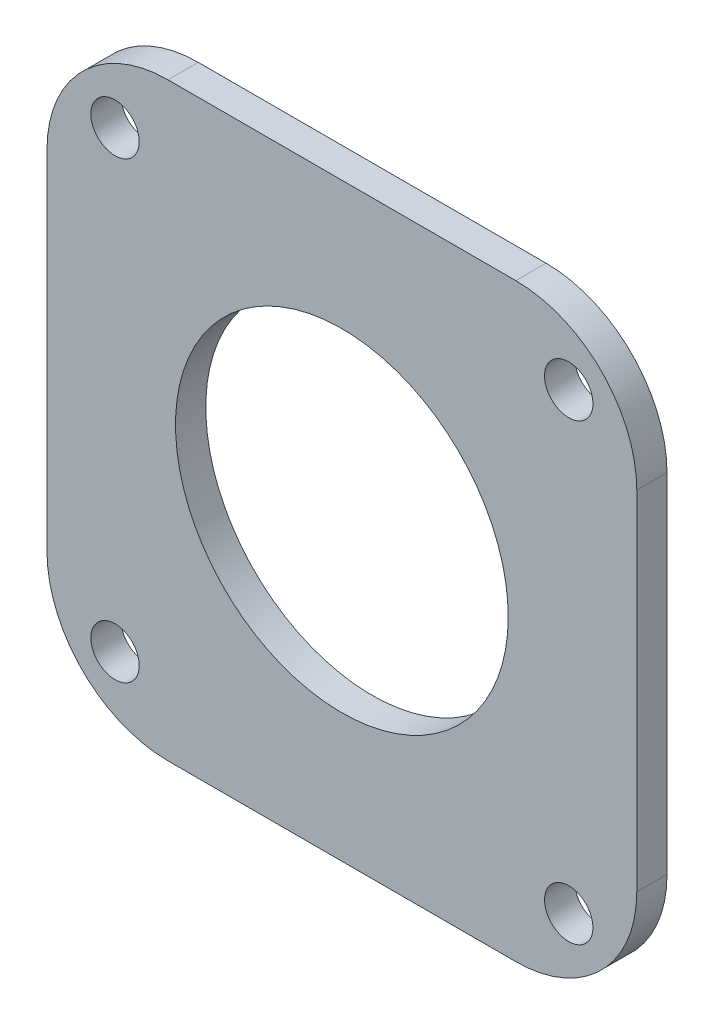
ISO-10303-21;
HEADER;
FILE_DESCRIPTION(('STEP AP214'),'2;1');
FILE_NAME('part.step','',(''),(''),'','','');
FILE_SCHEMA(('AUTOMOTIVE_DESIGN { 1 0 10303 214 1 1 1 1 }'));
ENDSEC;
DATA;
#1=APPLICATION_CONTEXT('core data for automotive mechanical design processes');
#2=APPLICATION_PROTOCOL_DEFINITION('international standard','automotive_design',2000,#1);
#3=PRODUCT_CONTEXT('',#1,'mechanical');
#4=PRODUCT('Part','Part','',(#3));
#5=PRODUCT_RELATED_PRODUCT_CATEGORY('part','',(#4));
#6=PRODUCT_DEFINITION_FORMATION('','',#4);
#7=PRODUCT_DEFINITION_CONTEXT('part definition',#1,'design');
#8=PRODUCT_DEFINITION('design','',#6,#7);
#9=PRODUCT_DEFINITION_SHAPE('','',#8);
#10=(LENGTH_UNIT() NAMED_UNIT(*) SI_UNIT(.MILLI.,.METRE.));
#11=(NAMED_UNIT(*) PLANE_ANGLE_UNIT() SI_UNIT($,.RADIAN.));
#12=(NAMED_UNIT(*) SI_UNIT($,.STERADIAN.) SOLID_ANGLE_UNIT());
#13=UNCERTAINTY_MEASURE_WITH_UNIT(LENGTH_MEASURE(1.E-05),#10,'distance_accuracy_value','');
#14=(GEOMETRIC_REPRESENTATION_CONTEXT(3) GLOBAL_UNCERTAINTY_ASSIGNED_CONTEXT((#13)) GLOBAL_UNIT_ASSIGNED_CONTEXT((#10,
#11,#12)) REPRESENTATION_CONTEXT('',''));
#15=CARTESIAN_POINT('',(0.,0.,0.));
#16=DIRECTION('',(0.,0.,1.));
#17=DIRECTION('',(1.,0.,0.));
#18=AXIS2_PLACEMENT_3D('',#15,#16,#17);
#19=CARTESIAN_POINT('',(11.5,-11.5,2.));
#20=DIRECTION('',(0.,0.,1.));
#21=DIRECTION('',(1.,0.,0.));
#22=AXIS2_PLACEMENT_3D('',#19,#20,#21);
#23=CYLINDRICAL_SURFACE('',#22,8.);
#24=DIRECTION('',(0.,0.,1.));
#25=VECTOR('',#24,1.);
#26=CARTESIAN_POINT('',(11.5,-19.5,2.));
#27=LINE('',#26,#25);
#28=CARTESIAN_POINT('',(11.5,-19.5,0.));
#29=VERTEX_POINT('',#28);
#30=CARTESIAN_POINT('',(11.5,-19.5,2.));
#31=VERTEX_POINT('',#30);
#32=EDGE_CURVE('E188',#29,#31,#27,.T.);
#33=ORIENTED_EDGE('',*,*,#32,.F.);
#34=CARTESIAN_POINT('',(11.5,-11.5,0.));
#35=DIRECTION('',(0.,0.,1.));
#36=DIRECTION('',(1.,0.,0.));
#37=AXIS2_PLACEMENT_3D('',#34,#35,#36);
#38=CIRCLE('',#37,8.);
#39=CARTESIAN_POINT('',(19.5,-11.5,0.));
#40=VERTEX_POINT('',#39);
#41=EDGE_CURVE('E55',#40,#29,#38,.F.);
#42=ORIENTED_EDGE('',*,*,#41,.F.);
#43=DIRECTION('',(0.,0.,1.));
#44=VECTOR('',#43,1.);
#45=CARTESIAN_POINT('',(19.5,-11.5,2.));
#46=LINE('',#45,#44);
#47=CARTESIAN_POINT('',(19.5,-11.5,2.));
#48=VERTEX_POINT('',#47);
#49=EDGE_CURVE('E192',#48,#40,#46,.F.);
#50=ORIENTED_EDGE('',*,*,#49,.F.);
#51=CARTESIAN_POINT('',(11.5,-11.5,2.));
#52=DIRECTION('',(0.,0.,1.));
#53=DIRECTION('',(1.,0.,0.));
#54=AXIS2_PLACEMENT_3D('',#51,#52,#53);
#55=CIRCLE('',#54,8.);
#56=EDGE_CURVE('E11',#31,#48,#55,.T.);
#57=ORIENTED_EDGE('',*,*,#56,.F.);
#58=EDGE_LOOP('',(#33,#42,#50,#57));
#59=FACE_BOUND('',#58,.T.);
#60=ADVANCED_FACE('F46',(#59),#23,.T.);
#61=CARTESIAN_POINT('',(-11.5,-11.5,2.));
#62=DIRECTION('',(0.,0.,1.));
#63=DIRECTION('',(1.,0.,0.));
#64=AXIS2_PLACEMENT_3D('',#61,#62,#63);
#65=CYLINDRICAL_SURFACE('',#64,8.);
#66=DIRECTION('',(0.,0.,-1.));
#67=VECTOR('',#66,1.);
#68=CARTESIAN_POINT('',(-11.5,-19.5,2.));
#69=LINE('',#68,#67);
#70=CARTESIAN_POINT('',(-11.5,-19.5,2.));
#71=VERTEX_POINT('',#70);
#72=CARTESIAN_POINT('',(-11.5,-19.5,0.));
#73=VERTEX_POINT('',#72);
#74=EDGE_CURVE('E174',#71,#73,#69,.T.);
#75=ORIENTED_EDGE('',*,*,#74,.F.);
#76=CARTESIAN_POINT('',(-11.5,-11.5,2.));
#77=DIRECTION('',(0.,0.,1.));
#78=DIRECTION('',(1.,0.,0.));
#79=AXIS2_PLACEMENT_3D('',#76,#77,#78);
#80=CIRCLE('',#79,8.);
#81=CARTESIAN_POINT('',(-19.5,-11.5,2.));
#82=VERTEX_POINT('',#81);
#83=EDGE_CURVE('E182',#82,#71,#80,.T.);
#84=ORIENTED_EDGE('',*,*,#83,.F.);
#85=DIRECTION('',(0.,0.,-1.));
#86=VECTOR('',#85,1.);
#87=CARTESIAN_POINT('',(-19.5,-11.5,2.));
#88=LINE('',#87,#86);
#89=CARTESIAN_POINT('',(-19.5,-11.5,0.));
#90=VERTEX_POINT('',#89);
#91=EDGE_CURVE('E178',#90,#82,#88,.F.);
#92=ORIENTED_EDGE('',*,*,#91,.F.);
#93=CARTESIAN_POINT('',(-11.5,-11.5,0.));
#94=DIRECTION('',(0.,0.,1.));
#95=DIRECTION('',(1.,0.,0.));
#96=AXIS2_PLACEMENT_3D('',#93,#94,#95);
#97=CIRCLE('',#96,8.);
#98=EDGE_CURVE('E185',#73,#90,#97,.F.);
#99=ORIENTED_EDGE('',*,*,#98,.F.);
#100=EDGE_LOOP('',(#75,#84,#92,#99));
#101=FACE_BOUND('',#100,.T.);
#102=ADVANCED_FACE('F203',(#101),#65,.T.);
#103=CARTESIAN_POINT('',(11.5,11.5,2.));
#104=DIRECTION('',(0.,0.,-1.));
#105=DIRECTION('',(-1.,0.,0.));
#106=AXIS2_PLACEMENT_3D('',#103,#104,#105);
#107=CYLINDRICAL_SURFACE('',#106,8.);
#108=DIRECTION('',(0.,0.,1.));
#109=VECTOR('',#108,1.);
#110=CARTESIAN_POINT('',(19.5,11.5,2.));
#111=LINE('',#110,#109);
#112=CARTESIAN_POINT('',(19.5,11.5,0.));
#113=VERTEX_POINT('',#112);
#114=CARTESIAN_POINT('',(19.5,11.5,2.));
#115=VERTEX_POINT('',#114);
#116=EDGE_CURVE('E162',#113,#115,#111,.T.);
#117=ORIENTED_EDGE('',*,*,#116,.F.);
#118=CARTESIAN_POINT('',(11.5,11.5,0.));
#119=DIRECTION('',(0.,0.,1.));
#120=DIRECTION('',(1.,0.,0.));
#121=AXIS2_PLACEMENT_3D('',#118,#119,#120);
#122=CIRCLE('',#121,8.);
#123=CARTESIAN_POINT('',(11.5,19.5,0.));
#124=VERTEX_POINT('',#123);
#125=EDGE_CURVE('E168',#124,#113,#122,.F.);
#126=ORIENTED_EDGE('',*,*,#125,.F.);
#127=DIRECTION('',(0.,0.,1.));
#128=VECTOR('',#127,1.);
#129=CARTESIAN_POINT('',(11.5,19.5,2.));
#130=LINE('',#129,#128);
#131=CARTESIAN_POINT('',(11.5,19.5,2.));
#132=VERTEX_POINT('',#131);
#133=EDGE_CURVE('E138',#132,#124,#130,.F.);
#134=ORIENTED_EDGE('',*,*,#133,.F.);
#135=CARTESIAN_POINT('',(11.5,11.5,2.));
#136=DIRECTION('',(0.,0.,1.));
#137=DIRECTION('',(1.,0.,0.));
#138=AXIS2_PLACEMENT_3D('',#135,#136,#137);
#139=CIRCLE('',#138,8.);
#140=EDGE_CURVE('E171',#115,#132,#139,.T.);
#141=ORIENTED_EDGE('',*,*,#140,.F.);
#142=EDGE_LOOP('',(#117,#126,#134,#141));
#143=FACE_BOUND('',#142,.T.);
#144=ADVANCED_FACE('F263',(#143),#107,.T.);
#145=CARTESIAN_POINT('',(-11.5,11.5,2.));
#146=DIRECTION('',(0.,0.,1.));
#147=DIRECTION('',(1.,0.,0.));
#148=AXIS2_PLACEMENT_3D('',#145,#146,#147);
#149=CYLINDRICAL_SURFACE('',#148,8.);
#150=DIRECTION('',(0.,0.,1.));
#151=VECTOR('',#150,1.);
#152=CARTESIAN_POINT('',(-11.5,19.5,2.));
#153=LINE('',#152,#151);
#154=CARTESIAN_POINT('',(-11.5,19.5,0.));
#155=VERTEX_POINT('',#154);
#156=CARTESIAN_POINT('',(-11.5,19.5,2.));
#157=VERTEX_POINT('',#156);
#158=EDGE_CURVE('E126',#155,#157,#153,.T.);
#159=ORIENTED_EDGE('',*,*,#158,.F.);
#160=CARTESIAN_POINT('',(-11.5,11.5,0.));
#161=DIRECTION('',(0.,0.,1.));
#162=DIRECTION('',(1.,0.,0.));
#163=AXIS2_PLACEMENT_3D('',#160,#161,#162);
#164=CIRCLE('',#163,8.);
#165=CARTESIAN_POINT('',(-19.5,11.5,0.));
#166=VERTEX_POINT('',#165);
#167=EDGE_CURVE('E109',#166,#155,#164,.F.);
#168=ORIENTED_EDGE('',*,*,#167,.F.);
#169=DIRECTION('',(0.,0.,1.));
#170=VECTOR('',#169,1.);
#171=CARTESIAN_POINT('',(-19.5,11.5,2.));
#172=LINE('',#171,#170);
#173=CARTESIAN_POINT('',(-19.5,11.5,2.));
#174=VERTEX_POINT('',#173);
#175=EDGE_CURVE('E123',#174,#166,#172,.F.);
#176=ORIENTED_EDGE('',*,*,#175,.F.);
#177=CARTESIAN_POINT('',(-11.5,11.5,2.));
#178=DIRECTION('',(0.,0.,1.));
#179=DIRECTION('',(1.,0.,0.));
#180=AXIS2_PLACEMENT_3D('',#177,#178,#179);
#181=CIRCLE('',#180,8.);
#182=EDGE_CURVE('E122',#157,#174,#181,.T.);
#183=ORIENTED_EDGE('',*,*,#182,.F.);
#184=EDGE_LOOP('',(#159,#168,#176,#183));
#185=FACE_BOUND('',#184,.T.);
#186=ADVANCED_FACE('F127',(#185),#149,.T.);
#187=CARTESIAN_POINT('',(0.,19.5,2.));
#188=DIRECTION('',(0.,1.,0.));
#189=DIRECTION('',(0.,0.,1.));
#190=AXIS2_PLACEMENT_3D('',#187,#188,#189);
#191=PLANE('',#190);
#192=DIRECTION('',(1.,0.,0.));
#193=VECTOR('',#192,1.);
#194=CARTESIAN_POINT('',(0.,19.5,2.));
#195=LINE('',#194,#193);
#196=EDGE_CURVE('E210',#157,#132,#195,.T.);
#197=ORIENTED_EDGE('',*,*,#196,.T.);
#198=ORIENTED_EDGE('',*,*,#133,.T.);
#199=DIRECTION('',(1.,0.,0.));
#200=VECTOR('',#199,1.);
#201=CARTESIAN_POINT('',(0.,19.5,0.));
#202=LINE('',#201,#200);
#203=EDGE_CURVE('E115',#155,#124,#202,.T.);
#204=ORIENTED_EDGE('',*,*,#203,.F.);
#205=ORIENTED_EDGE('',*,*,#158,.T.);
#206=EDGE_LOOP('',(#197,#198,#204,#205));
#207=FACE_BOUND('',#206,.T.);
#208=ADVANCED_FACE('F136',(#207),#191,.T.);
#209=CARTESIAN_POINT('',(-19.5,0.,2.));
#210=DIRECTION('',(-1.,0.,0.));
#211=DIRECTION('',(0.,0.,1.));
#212=AXIS2_PLACEMENT_3D('',#209,#210,#211);
#213=PLANE('',#212);
#214=DIRECTION('',(0.,1.,0.));
#215=VECTOR('',#214,1.);
#216=CARTESIAN_POINT('',(-19.5,0.,0.));
#217=LINE('',#216,#215);
#218=EDGE_CURVE('E117',#90,#166,#217,.T.);
#219=ORIENTED_EDGE('',*,*,#218,.F.);
#220=ORIENTED_EDGE('',*,*,#91,.T.);
#221=DIRECTION('',(0.,1.,0.));
#222=VECTOR('',#221,1.);
#223=CARTESIAN_POINT('',(-19.5,0.,2.));
#224=LINE('',#223,#222);
#225=EDGE_CURVE('E208',#82,#174,#224,.T.);
#226=ORIENTED_EDGE('',*,*,#225,.T.);
#227=ORIENTED_EDGE('',*,*,#175,.T.);
#228=EDGE_LOOP('',(#219,#220,#226,#227));
#229=FACE_BOUND('',#228,.T.);
#230=ADVANCED_FACE('F207',(#229),#213,.T.);
#231=CARTESIAN_POINT('',(0.,-19.5,2.));
#232=DIRECTION('',(0.,1.,0.));
#233=DIRECTION('',(0.,0.,1.));
#234=AXIS2_PLACEMENT_3D('',#231,#232,#233);
#235=PLANE('',#234);
#236=DIRECTION('',(1.,0.,0.));
#237=VECTOR('',#236,1.);
#238=CARTESIAN_POINT('',(0.,-19.5,0.));
#239=LINE('',#238,#237);
#240=EDGE_CURVE('E144',#73,#29,#239,.T.);
#241=ORIENTED_EDGE('',*,*,#240,.T.);
#242=ORIENTED_EDGE('',*,*,#32,.T.);
#243=DIRECTION('',(1.,0.,0.));
#244=VECTOR('',#243,1.);
#245=CARTESIAN_POINT('',(0.,-19.5,2.));
#246=LINE('',#245,#244);
#247=EDGE_CURVE('E201',#71,#31,#246,.T.);
#248=ORIENTED_EDGE('',*,*,#247,.F.);
#249=ORIENTED_EDGE('',*,*,#74,.T.);
#250=EDGE_LOOP('',(#241,#242,#248,#249));
#251=FACE_BOUND('',#250,.T.);
#252=ADVANCED_FACE('F199',(#251),#235,.F.);
#253=CARTESIAN_POINT('',(19.5,0.,2.));
#254=DIRECTION('',(-1.,0.,0.));
#255=DIRECTION('',(0.,0.,1.));
#256=AXIS2_PLACEMENT_3D('',#253,#254,#255);
#257=PLANE('',#256);
#258=DIRECTION('',(0.,1.,0.));
#259=VECTOR('',#258,1.);
#260=CARTESIAN_POINT('',(19.5,0.,2.));
#261=LINE('',#260,#259);
#262=EDGE_CURVE('E133',#48,#115,#261,.T.);
#263=ORIENTED_EDGE('',*,*,#262,.F.);
#264=ORIENTED_EDGE('',*,*,#49,.T.);
#265=DIRECTION('',(0.,1.,0.));
#266=VECTOR('',#265,1.);
#267=CARTESIAN_POINT('',(19.5,0.,0.));
#268=LINE('',#267,#266);
#269=EDGE_CURVE('E154',#40,#113,#268,.T.);
#270=ORIENTED_EDGE('',*,*,#269,.T.);
#271=ORIENTED_EDGE('',*,*,#116,.T.);
#272=EDGE_LOOP('',(#263,#264,#270,#271));
#273=FACE_BOUND('',#272,.T.);
#274=ADVANCED_FACE('F253',(#273),#257,.F.);
#275=CARTESIAN_POINT('',(15.,15.,2.));
#276=DIRECTION('',(0.,0.,-1.));
#277=DIRECTION('',(-1.,0.,0.));
#278=AXIS2_PLACEMENT_3D('',#275,#276,#277);
#279=CYLINDRICAL_SURFACE('',#278,1.6);
#280=CARTESIAN_POINT('',(15.,15.,2.));
#281=DIRECTION('',(0.,0.,1.));
#282=DIRECTION('',(1.,0.,0.));
#283=AXIS2_PLACEMENT_3D('',#280,#281,#282);
#284=CIRCLE('',#283,1.6);
#285=CARTESIAN_POINT('',(16.6,15.,2.));
#286=VERTEX_POINT('',#285);
#287=EDGE_CURVE('E215',#286,#286,#284,.T.);
#288=ORIENTED_EDGE('',*,*,#287,.T.);
#289=EDGE_LOOP('',(#288));
#290=FACE_BOUND('',#289,.T.);
#291=CARTESIAN_POINT('',(15.,15.,0.));
#292=DIRECTION('',(0.,0.,1.));
#293=DIRECTION('',(1.,0.,0.));
#294=AXIS2_PLACEMENT_3D('',#291,#292,#293);
#295=CIRCLE('',#294,1.6);
#296=CARTESIAN_POINT('',(16.6,15.,0.));
#297=VERTEX_POINT('',#296);
#298=EDGE_CURVE('E140',#297,#297,#295,.T.);
#299=ORIENTED_EDGE('',*,*,#298,.F.);
#300=EDGE_LOOP('',(#299));
#301=FACE_BOUND('',#300,.T.);
#302=ADVANCED_FACE('F243',(#290,#301),#279,.F.);
#303=CARTESIAN_POINT('',(14.9999999999999,-15.0000000000001,2.));
#304=DIRECTION('',(0.,0.,-1.));
#305=DIRECTION('',(-1.,0.,0.));
#306=AXIS2_PLACEMENT_3D('',#303,#304,#305);
#307=CYLINDRICAL_SURFACE('',#306,1.6);
#308=CARTESIAN_POINT('',(14.9999999999999,-15.0000000000001,2.));
#309=DIRECTION('',(0.,0.,1.));
#310=DIRECTION('',(1.,0.,0.));
#311=AXIS2_PLACEMENT_3D('',#308,#309,#310);
#312=CIRCLE('',#311,1.6);
#313=CARTESIAN_POINT('',(16.5999999999999,-15.0000000000001,2.));
#314=VERTEX_POINT('',#313);
#315=EDGE_CURVE('E219',#314,#314,#312,.T.);
#316=ORIENTED_EDGE('',*,*,#315,.T.);
#317=EDGE_LOOP('',(#316));
#318=FACE_BOUND('',#317,.T.);
#319=CARTESIAN_POINT('',(14.9999999999999,-15.0000000000001,0.));
#320=DIRECTION('',(0.,0.,1.));
#321=DIRECTION('',(1.,0.,0.));
#322=AXIS2_PLACEMENT_3D('',#319,#320,#321);
#323=CIRCLE('',#322,1.6);
#324=CARTESIAN_POINT('',(16.5999999999999,-15.0000000000001,0.));
#325=VERTEX_POINT('',#324);
#326=EDGE_CURVE('E147',#325,#325,#323,.T.);
#327=ORIENTED_EDGE('',*,*,#326,.F.);
#328=EDGE_LOOP('',(#327));
#329=FACE_BOUND('',#328,.T.);
#330=ADVANCED_FACE('F240',(#318,#329),#307,.F.);
#331=CARTESIAN_POINT('',(-15.0000000000002,-14.9999999999998,2.));
#332=DIRECTION('',(0.,0.,-1.));
#333=DIRECTION('',(-1.,0.,0.));
#334=AXIS2_PLACEMENT_3D('',#331,#332,#333);
#335=CYLINDRICAL_SURFACE('',#334,1.6);
#336=CARTESIAN_POINT('',(-15.0000000000002,-14.9999999999998,2.));
#337=DIRECTION('',(0.,0.,1.));
#338=DIRECTION('',(1.,0.,0.));
#339=AXIS2_PLACEMENT_3D('',#336,#337,#338);
#340=CIRCLE('',#339,1.6);
#341=CARTESIAN_POINT('',(-13.4000000000002,-14.9999999999998,2.));
#342=VERTEX_POINT('',#341);
#343=EDGE_CURVE('E403',#342,#342,#340,.T.);
#344=ORIENTED_EDGE('',*,*,#343,.T.);
#345=EDGE_LOOP('',(#344));
#346=FACE_BOUND('',#345,.T.);
#347=CARTESIAN_POINT('',(-15.0000000000002,-14.9999999999998,0.));
#348=DIRECTION('',(0.,0.,1.));
#349=DIRECTION('',(1.,0.,0.));
#350=AXIS2_PLACEMENT_3D('',#347,#348,#349);
#351=CIRCLE('',#350,1.6);
#352=CARTESIAN_POINT('',(-13.4000000000002,-14.9999999999998,0.));
#353=VERTEX_POINT('',#352);
#354=EDGE_CURVE('E231',#353,#353,#351,.T.);
#355=ORIENTED_EDGE('',*,*,#354,.F.);
#356=EDGE_LOOP('',(#355));
#357=FACE_BOUND('',#356,.T.);
#358=ADVANCED_FACE('F242',(#346,#357),#335,.F.);
#359=CARTESIAN_POINT('',(-15.,15.,2.));
#360=DIRECTION('',(0.,0.,-1.));
#361=DIRECTION('',(-1.,0.,0.));
#362=AXIS2_PLACEMENT_3D('',#359,#360,#361);
#363=CYLINDRICAL_SURFACE('',#362,1.6);
#364=CARTESIAN_POINT('',(-15.,15.,2.));
#365=DIRECTION('',(0.,0.,1.));
#366=DIRECTION('',(1.,0.,0.));
#367=AXIS2_PLACEMENT_3D('',#364,#365,#366);
#368=CIRCLE('',#367,1.6);
#369=CARTESIAN_POINT('',(-13.4,15.,2.));
#370=VERTEX_POINT('',#369);
#371=EDGE_CURVE('E156',#370,#370,#368,.T.);
#372=ORIENTED_EDGE('',*,*,#371,.T.);
#373=EDGE_LOOP('',(#372));
#374=FACE_BOUND('',#373,.T.);
#375=CARTESIAN_POINT('',(-15.,15.,0.));
#376=DIRECTION('',(0.,0.,1.));
#377=DIRECTION('',(1.,0.,0.));
#378=AXIS2_PLACEMENT_3D('',#375,#376,#377);
#379=CIRCLE('',#378,1.6);
#380=CARTESIAN_POINT('',(-13.4,15.,0.));
#381=VERTEX_POINT('',#380);
#382=EDGE_CURVE('E227',#381,#381,#379,.T.);
#383=ORIENTED_EDGE('',*,*,#382,.F.);
#384=EDGE_LOOP('',(#383));
#385=FACE_BOUND('',#384,.T.);
#386=ADVANCED_FACE('F250',(#374,#385),#363,.F.);
#387=CARTESIAN_POINT('',(0.,0.,2.));
#388=DIRECTION('',(0.,0.,1.));
#389=DIRECTION('',(1.,0.,0.));
#390=AXIS2_PLACEMENT_3D('',#387,#388,#389);
#391=PLANE('',#390);
#392=CARTESIAN_POINT('',(0.,0.,2.));
#393=DIRECTION('',(0.,0.,1.));
#394=DIRECTION('',(1.,0.,0.));
#395=AXIS2_PLACEMENT_3D('',#392,#393,#394);
#396=CIRCLE('',#395,11.);
#397=CARTESIAN_POINT('',(11.,0.,2.));
#398=VERTEX_POINT('',#397);
#399=EDGE_CURVE('E395',#398,#398,#396,.T.);
#400=ORIENTED_EDGE('',*,*,#399,.F.);
#401=EDGE_LOOP('',(#400));
#402=FACE_BOUND('',#401,.T.);
#403=ORIENTED_EDGE('',*,*,#371,.F.);
#404=EDGE_LOOP('',(#403));
#405=FACE_BOUND('',#404,.T.);
#406=ORIENTED_EDGE('',*,*,#343,.F.);
#407=EDGE_LOOP('',(#406));
#408=FACE_BOUND('',#407,.T.);
#409=ORIENTED_EDGE('',*,*,#315,.F.);
#410=EDGE_LOOP('',(#409));
#411=FACE_BOUND('',#410,.T.);
#412=ORIENTED_EDGE('',*,*,#287,.F.);
#413=EDGE_LOOP('',(#412));
#414=FACE_BOUND('',#413,.T.);
#415=ORIENTED_EDGE('',*,*,#247,.T.);
#416=ORIENTED_EDGE('',*,*,#56,.T.);
#417=ORIENTED_EDGE('',*,*,#262,.T.);
#418=ORIENTED_EDGE('',*,*,#140,.T.);
#419=ORIENTED_EDGE('',*,*,#196,.F.);
#420=ORIENTED_EDGE('',*,*,#182,.T.);
#421=ORIENTED_EDGE('',*,*,#225,.F.);
#422=ORIENTED_EDGE('',*,*,#83,.T.);
#423=EDGE_LOOP('',(#415,#416,#417,#418,#419,#420,#421,#422));
#424=FACE_BOUND('',#423,.T.);
#425=ADVANCED_FACE('F212',(#402,#405,#408,#411,#414,#424),#391,.T.);
#426=CARTESIAN_POINT('',(0.,0.,0.));
#427=DIRECTION('',(0.,0.,1.));
#428=DIRECTION('',(1.,0.,0.));
#429=AXIS2_PLACEMENT_3D('',#426,#427,#428);
#430=PLANE('',#429);
#431=CARTESIAN_POINT('',(0.,0.,0.));
#432=DIRECTION('',(0.,0.,1.));
#433=DIRECTION('',(1.,0.,0.));
#434=AXIS2_PLACEMENT_3D('',#431,#432,#433);
#435=CIRCLE('',#434,11.);
#436=CARTESIAN_POINT('',(11.,0.,0.));
#437=VERTEX_POINT('',#436);
#438=EDGE_CURVE('E49',#437,#437,#435,.T.);
#439=ORIENTED_EDGE('',*,*,#438,.T.);
#440=EDGE_LOOP('',(#439));
#441=FACE_BOUND('',#440,.T.);
#442=ORIENTED_EDGE('',*,*,#382,.T.);
#443=EDGE_LOOP('',(#442));
#444=FACE_BOUND('',#443,.T.);
#445=ORIENTED_EDGE('',*,*,#354,.T.);
#446=EDGE_LOOP('',(#445));
#447=FACE_BOUND('',#446,.T.);
#448=ORIENTED_EDGE('',*,*,#326,.T.);
#449=EDGE_LOOP('',(#448));
#450=FACE_BOUND('',#449,.T.);
#451=ORIENTED_EDGE('',*,*,#298,.T.);
#452=EDGE_LOOP('',(#451));
#453=FACE_BOUND('',#452,.T.);
#454=ORIENTED_EDGE('',*,*,#269,.F.);
#455=ORIENTED_EDGE('',*,*,#41,.T.);
#456=ORIENTED_EDGE('',*,*,#240,.F.);
#457=ORIENTED_EDGE('',*,*,#98,.T.);
#458=ORIENTED_EDGE('',*,*,#218,.T.);
#459=ORIENTED_EDGE('',*,*,#167,.T.);
#460=ORIENTED_EDGE('',*,*,#203,.T.);
#461=ORIENTED_EDGE('',*,*,#125,.T.);
#462=EDGE_LOOP('',(#454,#455,#456,#457,#458,#459,#460,#461));
#463=FACE_BOUND('',#462,.T.);
#464=ADVANCED_FACE('F112',(#441,#444,#447,#450,#453,#463),#430,.F.);
#465=CARTESIAN_POINT('',(0.,0.,-8.));
#466=DIRECTION('',(0.,0.,1.));
#467=DIRECTION('',(1.,0.,0.));
#468=AXIS2_PLACEMENT_3D('',#465,#466,#467);
#469=CYLINDRICAL_SURFACE('',#468,11.);
#470=ORIENTED_EDGE('',*,*,#399,.T.);
#471=EDGE_LOOP('',(#470));
#472=FACE_BOUND('',#471,.T.);
#473=ORIENTED_EDGE('',*,*,#438,.F.);
#474=EDGE_LOOP('',(#473));
#475=FACE_BOUND('',#474,.T.);
#476=ADVANCED_FACE('F287',(#472,#475),#469,.F.);
#477=CLOSED_SHELL('',(#60,#102,#144,#186,#208,#230,#252,#274,#302,#330,#358,#386,#425,#464,#476));
#478=MANIFOLD_SOLID_BREP('B2',#477);
#479=ADVANCED_BREP_SHAPE_REPRESENTATION('',(#18,#478),#14);
#480=SHAPE_DEFINITION_REPRESENTATION(#9,#479);
ENDSEC;
END-ISO-10303-21;
